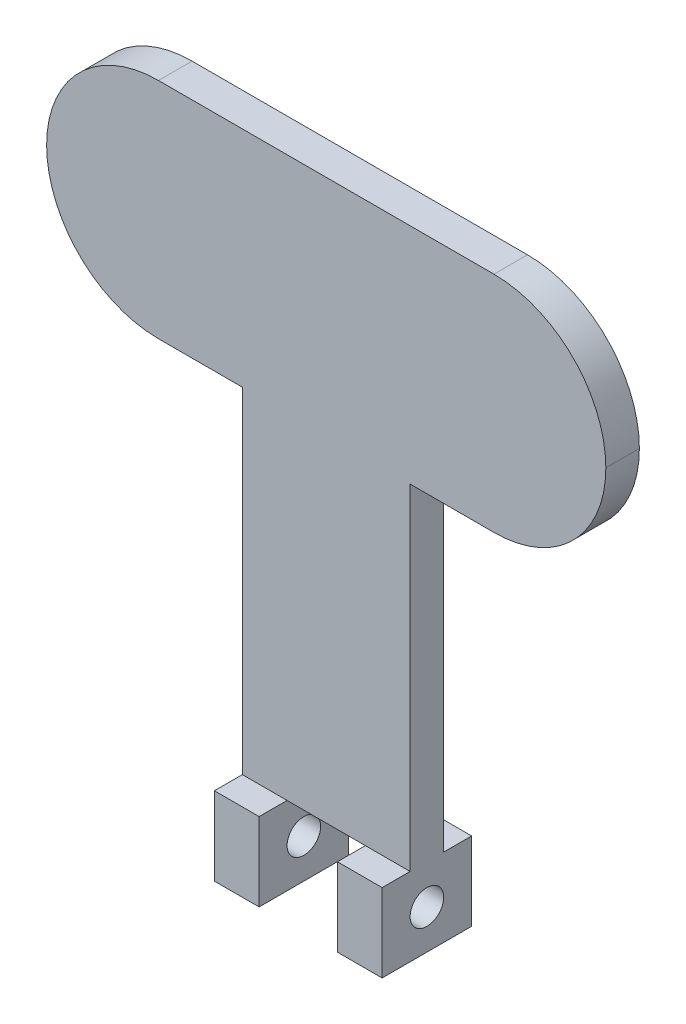
ISO-10303-21;
HEADER;
FILE_DESCRIPTION(('STEP AP214'),'2;1');
FILE_NAME('part.step','',(''),(''),'','','');
FILE_SCHEMA(('AUTOMOTIVE_DESIGN { 1 0 10303 214 1 1 1 1 }'));
ENDSEC;
DATA;
#1=APPLICATION_CONTEXT('core data for automotive mechanical design processes');
#2=APPLICATION_PROTOCOL_DEFINITION('international standard','automotive_design',2000,#1);
#3=PRODUCT_CONTEXT('',#1,'mechanical');
#4=PRODUCT('Part','Part','',(#3));
#5=PRODUCT_RELATED_PRODUCT_CATEGORY('part','',(#4));
#6=PRODUCT_DEFINITION_FORMATION('','',#4);
#7=PRODUCT_DEFINITION_CONTEXT('part definition',#1,'design');
#8=PRODUCT_DEFINITION('design','',#6,#7);
#9=PRODUCT_DEFINITION_SHAPE('','',#8);
#10=(LENGTH_UNIT() NAMED_UNIT(*) SI_UNIT(.MILLI.,.METRE.));
#11=(NAMED_UNIT(*) PLANE_ANGLE_UNIT() SI_UNIT($,.RADIAN.));
#12=(NAMED_UNIT(*) SI_UNIT($,.STERADIAN.) SOLID_ANGLE_UNIT());
#13=UNCERTAINTY_MEASURE_WITH_UNIT(LENGTH_MEASURE(1.E-05),#10,'distance_accuracy_value','');
#14=(GEOMETRIC_REPRESENTATION_CONTEXT(3) GLOBAL_UNCERTAINTY_ASSIGNED_CONTEXT((#13)) GLOBAL_UNIT_ASSIGNED_CONTEXT((#10,
#11,#12)) REPRESENTATION_CONTEXT('',''));
#15=CARTESIAN_POINT('',(0.,0.,0.));
#16=DIRECTION('',(0.,0.,1.));
#17=DIRECTION('',(1.,0.,0.));
#18=AXIS2_PLACEMENT_3D('',#15,#16,#17);
#19=CARTESIAN_POINT('',(7.5,-40.,3.));
#20=DIRECTION('',(0.,-1.,0.));
#21=DIRECTION('',(0.,0.,-1.));
#22=AXIS2_PLACEMENT_3D('',#19,#20,#21);
#23=PLANE('',#22);
#24=DIRECTION('',(-1.,0.,0.));
#25=VECTOR('',#24,1.);
#26=CARTESIAN_POINT('',(7.5,-40.,3.));
#27=LINE('',#26,#25);
#28=CARTESIAN_POINT('',(3.5,-40.,3.));
#29=VERTEX_POINT('',#28);
#30=CARTESIAN_POINT('',(-3.5,-40.,3.));
#31=VERTEX_POINT('',#30);
#32=EDGE_CURVE('E277',#29,#31,#27,.T.);
#33=ORIENTED_EDGE('',*,*,#32,.T.);
#34=DIRECTION('',(0.,0.,-1.));
#35=VECTOR('',#34,1.);
#36=CARTESIAN_POINT('',(-3.5,-40.,3.));
#37=LINE('',#36,#35);
#38=CARTESIAN_POINT('',(-3.5,-40.,0.));
#39=VERTEX_POINT('',#38);
#40=EDGE_CURVE('E11',#31,#39,#37,.T.);
#41=ORIENTED_EDGE('',*,*,#40,.T.);
#42=DIRECTION('',(-1.,0.,0.));
#43=VECTOR('',#42,1.);
#44=CARTESIAN_POINT('',(7.5,-40.,0.));
#45=LINE('',#44,#43);
#46=CARTESIAN_POINT('',(3.5,-40.,0.));
#47=VERTEX_POINT('',#46);
#48=EDGE_CURVE('E287',#47,#39,#45,.T.);
#49=ORIENTED_EDGE('',*,*,#48,.F.);
#50=DIRECTION('',(0.,0.,-1.));
#51=VECTOR('',#50,1.);
#52=CARTESIAN_POINT('',(3.5,-40.,5.5));
#53=LINE('',#52,#51);
#54=EDGE_CURVE('E51',#29,#47,#53,.T.);
#55=ORIENTED_EDGE('',*,*,#54,.F.);
#56=EDGE_LOOP('',(#33,#41,#49,#55));
#57=FACE_BOUND('',#56,.T.);
#58=ADVANCED_FACE('F41',(#57),#23,.T.);
#59=CARTESIAN_POINT('',(-25.,-10.,3.));
#60=DIRECTION('',(0.,1.,0.));
#61=DIRECTION('',(0.,0.,1.));
#62=AXIS2_PLACEMENT_3D('',#59,#60,#61);
#63=PLANE('',#62);
#64=DIRECTION('',(1.,0.,0.));
#65=VECTOR('',#64,1.);
#66=CARTESIAN_POINT('',(-25.,-10.,0.));
#67=LINE('',#66,#65);
#68=CARTESIAN_POINT('',(-15.,-10.,0.));
#69=VERTEX_POINT('',#68);
#70=CARTESIAN_POINT('',(-7.5,-10.,0.));
#71=VERTEX_POINT('',#70);
#72=EDGE_CURVE('E301',#69,#71,#67,.T.);
#73=ORIENTED_EDGE('',*,*,#72,.T.);
#74=DIRECTION('',(0.,0.,-1.));
#75=VECTOR('',#74,1.);
#76=CARTESIAN_POINT('',(-7.5,-10.,3.));
#77=LINE('',#76,#75);
#78=CARTESIAN_POINT('',(-7.5,-10.,3.));
#79=VERTEX_POINT('',#78);
#80=EDGE_CURVE('E276',#79,#71,#77,.T.);
#81=ORIENTED_EDGE('',*,*,#80,.F.);
#82=DIRECTION('',(1.,0.,0.));
#83=VECTOR('',#82,1.);
#84=CARTESIAN_POINT('',(-25.,-10.,3.));
#85=LINE('',#84,#83);
#86=CARTESIAN_POINT('',(-15.,-10.,3.));
#87=VERTEX_POINT('',#86);
#88=EDGE_CURVE('E302',#87,#79,#85,.T.);
#89=ORIENTED_EDGE('',*,*,#88,.F.);
#90=DIRECTION('',(0.,0.,1.));
#91=VECTOR('',#90,1.);
#92=CARTESIAN_POINT('',(-15.,-10.,3.));
#93=LINE('',#92,#91);
#94=EDGE_CURVE('E353',#87,#69,#93,.F.);
#95=ORIENTED_EDGE('',*,*,#94,.T.);
#96=EDGE_LOOP('',(#73,#81,#89,#95));
#97=FACE_BOUND('',#96,.T.);
#98=ADVANCED_FACE('F415',(#97),#63,.F.);
#99=CARTESIAN_POINT('',(-15.,0.,3.));
#100=DIRECTION('',(0.,0.,1.));
#101=DIRECTION('',(1.,0.,0.));
#102=AXIS2_PLACEMENT_3D('',#99,#100,#101);
#103=CYLINDRICAL_SURFACE('',#102,10.);
#104=DIRECTION('',(0.,0.,1.));
#105=VECTOR('',#104,1.);
#106=CARTESIAN_POINT('',(-25.,0.,3.));
#107=LINE('',#106,#105);
#108=CARTESIAN_POINT('',(-25.,0.,3.));
#109=VERTEX_POINT('',#108);
#110=CARTESIAN_POINT('',(-25.,0.,0.));
#111=VERTEX_POINT('',#110);
#112=EDGE_CURVE('E331',#109,#111,#107,.F.);
#113=ORIENTED_EDGE('',*,*,#112,.T.);
#114=CARTESIAN_POINT('',(-15.,0.,0.));
#115=DIRECTION('',(0.,0.,-1.));
#116=DIRECTION('',(-1.,0.,0.));
#117=AXIS2_PLACEMENT_3D('',#114,#115,#116);
#118=CIRCLE('',#117,10.);
#119=EDGE_CURVE('E357',#69,#111,#118,.T.);
#120=ORIENTED_EDGE('',*,*,#119,.F.);
#121=ORIENTED_EDGE('',*,*,#94,.F.);
#122=CARTESIAN_POINT('',(-15.,0.,3.));
#123=DIRECTION('',(0.,0.,-1.));
#124=DIRECTION('',(-1.,0.,0.));
#125=AXIS2_PLACEMENT_3D('',#122,#123,#124);
#126=CIRCLE('',#125,10.);
#127=EDGE_CURVE('E360',#109,#87,#126,.F.);
#128=ORIENTED_EDGE('',*,*,#127,.F.);
#129=EDGE_LOOP('',(#113,#120,#121,#128));
#130=FACE_BOUND('',#129,.T.);
#131=ADVANCED_FACE('F43',(#130),#103,.T.);
#132=CARTESIAN_POINT('',(15.,0.,3.));
#133=DIRECTION('',(0.,0.,-1.));
#134=DIRECTION('',(-1.,0.,0.));
#135=AXIS2_PLACEMENT_3D('',#132,#133,#134);
#136=CYLINDRICAL_SURFACE('',#135,10.);
#137=DIRECTION('',(0.,0.,1.));
#138=VECTOR('',#137,1.);
#139=CARTESIAN_POINT('',(25.,0.,3.));
#140=LINE('',#139,#138);
#141=CARTESIAN_POINT('',(25.,0.,0.));
#142=VERTEX_POINT('',#141);
#143=CARTESIAN_POINT('',(25.,0.,3.));
#144=VERTEX_POINT('',#143);
#145=EDGE_CURVE('E306',#142,#144,#140,.T.);
#146=ORIENTED_EDGE('',*,*,#145,.T.);
#147=CARTESIAN_POINT('',(15.,0.,3.));
#148=DIRECTION('',(0.,0.,-1.));
#149=DIRECTION('',(-1.,0.,0.));
#150=AXIS2_PLACEMENT_3D('',#147,#148,#149);
#151=CIRCLE('',#150,10.);
#152=CARTESIAN_POINT('',(15.,-10.,3.));
#153=VERTEX_POINT('',#152);
#154=EDGE_CURVE('E346',#153,#144,#151,.F.);
#155=ORIENTED_EDGE('',*,*,#154,.F.);
#156=DIRECTION('',(0.,0.,-1.));
#157=VECTOR('',#156,1.);
#158=CARTESIAN_POINT('',(15.,-10.,3.));
#159=LINE('',#158,#157);
#160=CARTESIAN_POINT('',(15.,-10.,0.));
#161=VERTEX_POINT('',#160);
#162=EDGE_CURVE('E342',#161,#153,#159,.F.);
#163=ORIENTED_EDGE('',*,*,#162,.F.);
#164=CARTESIAN_POINT('',(15.,0.,0.));
#165=DIRECTION('',(0.,0.,-1.));
#166=DIRECTION('',(-1.,0.,0.));
#167=AXIS2_PLACEMENT_3D('',#164,#165,#166);
#168=CIRCLE('',#167,10.);
#169=EDGE_CURVE('E349',#142,#161,#168,.T.);
#170=ORIENTED_EDGE('',*,*,#169,.F.);
#171=EDGE_LOOP('',(#146,#155,#163,#170));
#172=FACE_BOUND('',#171,.T.);
#173=ADVANCED_FACE('F616',(#172),#136,.T.);
#174=CARTESIAN_POINT('',(-15.,0.,3.));
#175=DIRECTION('',(0.,0.,1.));
#176=DIRECTION('',(1.,0.,0.));
#177=AXIS2_PLACEMENT_3D('',#174,#175,#176);
#178=CYLINDRICAL_SURFACE('',#177,10.);
#179=DIRECTION('',(0.,0.,1.));
#180=VECTOR('',#179,1.);
#181=CARTESIAN_POINT('',(-15.,10.,3.));
#182=LINE('',#181,#180);
#183=CARTESIAN_POINT('',(-15.,10.,0.));
#184=VERTEX_POINT('',#183);
#185=CARTESIAN_POINT('',(-15.,10.,3.));
#186=VERTEX_POINT('',#185);
#187=EDGE_CURVE('E327',#184,#186,#182,.T.);
#188=ORIENTED_EDGE('',*,*,#187,.F.);
#189=CARTESIAN_POINT('',(-15.,0.,0.));
#190=DIRECTION('',(0.,0.,-1.));
#191=DIRECTION('',(-1.,0.,0.));
#192=AXIS2_PLACEMENT_3D('',#189,#190,#191);
#193=CIRCLE('',#192,10.);
#194=EDGE_CURVE('E335',#111,#184,#193,.T.);
#195=ORIENTED_EDGE('',*,*,#194,.F.);
#196=ORIENTED_EDGE('',*,*,#112,.F.);
#197=CARTESIAN_POINT('',(-15.,0.,3.));
#198=DIRECTION('',(0.,0.,-1.));
#199=DIRECTION('',(-1.,0.,0.));
#200=AXIS2_PLACEMENT_3D('',#197,#198,#199);
#201=CIRCLE('',#200,10.);
#202=EDGE_CURVE('E338',#186,#109,#201,.F.);
#203=ORIENTED_EDGE('',*,*,#202,.F.);
#204=EDGE_LOOP('',(#188,#195,#196,#203));
#205=FACE_BOUND('',#204,.T.);
#206=ADVANCED_FACE('F625',(#205),#178,.T.);
#207=CARTESIAN_POINT('',(15.,0.,3.));
#208=DIRECTION('',(0.,0.,1.));
#209=DIRECTION('',(1.,0.,0.));
#210=AXIS2_PLACEMENT_3D('',#207,#208,#209);
#211=CYLINDRICAL_SURFACE('',#210,10.);
#212=ORIENTED_EDGE('',*,*,#145,.F.);
#213=CARTESIAN_POINT('',(15.,0.,0.));
#214=DIRECTION('',(0.,0.,-1.));
#215=DIRECTION('',(-1.,0.,0.));
#216=AXIS2_PLACEMENT_3D('',#213,#214,#215);
#217=CIRCLE('',#216,10.);
#218=CARTESIAN_POINT('',(15.,10.,0.));
#219=VERTEX_POINT('',#218);
#220=EDGE_CURVE('E320',#219,#142,#217,.T.);
#221=ORIENTED_EDGE('',*,*,#220,.F.);
#222=DIRECTION('',(0.,0.,1.));
#223=VECTOR('',#222,1.);
#224=CARTESIAN_POINT('',(15.,10.,3.));
#225=LINE('',#224,#223);
#226=CARTESIAN_POINT('',(15.,10.,3.));
#227=VERTEX_POINT('',#226);
#228=EDGE_CURVE('E316',#227,#219,#225,.F.);
#229=ORIENTED_EDGE('',*,*,#228,.F.);
#230=CARTESIAN_POINT('',(15.,0.,3.));
#231=DIRECTION('',(0.,0.,-1.));
#232=DIRECTION('',(-1.,0.,0.));
#233=AXIS2_PLACEMENT_3D('',#230,#231,#232);
#234=CIRCLE('',#233,10.);
#235=EDGE_CURVE('E324',#144,#227,#234,.F.);
#236=ORIENTED_EDGE('',*,*,#235,.F.);
#237=EDGE_LOOP('',(#212,#221,#229,#236));
#238=FACE_BOUND('',#237,.T.);
#239=ADVANCED_FACE('F634',(#238),#211,.T.);
#240=CARTESIAN_POINT('',(-25.,10.,3.));
#241=DIRECTION('',(0.,-1.,0.));
#242=DIRECTION('',(0.,0.,-1.));
#243=AXIS2_PLACEMENT_3D('',#240,#241,#242);
#244=PLANE('',#243);
#245=DIRECTION('',(-1.,0.,0.));
#246=VECTOR('',#245,1.);
#247=CARTESIAN_POINT('',(-25.,10.,0.));
#248=LINE('',#247,#246);
#249=EDGE_CURVE('E292',#219,#184,#248,.T.);
#250=ORIENTED_EDGE('',*,*,#249,.T.);
#251=ORIENTED_EDGE('',*,*,#187,.T.);
#252=DIRECTION('',(-1.,0.,0.));
#253=VECTOR('',#252,1.);
#254=CARTESIAN_POINT('',(-25.,10.,3.));
#255=LINE('',#254,#253);
#256=EDGE_CURVE('E296',#227,#186,#255,.T.);
#257=ORIENTED_EDGE('',*,*,#256,.F.);
#258=ORIENTED_EDGE('',*,*,#228,.T.);
#259=EDGE_LOOP('',(#250,#251,#257,#258));
#260=FACE_BOUND('',#259,.T.);
#261=ADVANCED_FACE('F600',(#260),#244,.F.);
#262=CARTESIAN_POINT('',(7.5,-10.,3.));
#263=VERTEX_POINT('',#262);
#264=EDGE_CURVE('E300',#263,#153,#85,.T.);
#265=ORIENTED_EDGE('',*,*,#264,.F.);
#266=DIRECTION('',(0.,0.,-1.));
#267=VECTOR('',#266,1.);
#268=CARTESIAN_POINT('',(7.5,-10.,3.));
#269=LINE('',#268,#267);
#270=CARTESIAN_POINT('',(7.5,-10.,0.));
#271=VERTEX_POINT('',#270);
#272=EDGE_CURVE('E288',#263,#271,#269,.T.);
#273=ORIENTED_EDGE('',*,*,#272,.T.);
#274=EDGE_CURVE('E310',#271,#161,#67,.T.);
#275=ORIENTED_EDGE('',*,*,#274,.T.);
#276=ORIENTED_EDGE('',*,*,#162,.T.);
#277=EDGE_LOOP('',(#265,#273,#275,#276));
#278=FACE_BOUND('',#277,.T.);
#279=ADVANCED_FACE('F480',(#278),#63,.F.);
#280=CARTESIAN_POINT('',(0.,0.,3.));
#281=DIRECTION('',(0.,0.,-1.));
#282=DIRECTION('',(-1.,0.,0.));
#283=AXIS2_PLACEMENT_3D('',#280,#281,#282);
#284=PLANE('',#283);
#285=ORIENTED_EDGE('',*,*,#202,.T.);
#286=ORIENTED_EDGE('',*,*,#127,.T.);
#287=ORIENTED_EDGE('',*,*,#88,.T.);
#288=DIRECTION('',(0.,1.,0.));
#289=VECTOR('',#288,1.);
#290=CARTESIAN_POINT('',(-7.5,-40.,3.));
#291=LINE('',#290,#289);
#292=CARTESIAN_POINT('',(-7.5,-40.,3.));
#293=VERTEX_POINT('',#292);
#294=EDGE_CURVE('E263',#293,#79,#291,.T.);
#295=ORIENTED_EDGE('',*,*,#294,.F.);
#296=EDGE_CURVE('E271',#31,#293,#27,.T.);
#297=ORIENTED_EDGE('',*,*,#296,.F.);
#298=ORIENTED_EDGE('',*,*,#32,.F.);
#299=CARTESIAN_POINT('',(7.5,-40.,3.));
#300=VERTEX_POINT('',#299);
#301=EDGE_CURVE('E272',#300,#29,#27,.T.);
#302=ORIENTED_EDGE('',*,*,#301,.F.);
#303=DIRECTION('',(0.,-1.,0.));
#304=VECTOR('',#303,1.);
#305=CARTESIAN_POINT('',(7.5,-40.,3.));
#306=LINE('',#305,#304);
#307=EDGE_CURVE('E267',#263,#300,#306,.T.);
#308=ORIENTED_EDGE('',*,*,#307,.F.);
#309=ORIENTED_EDGE('',*,*,#264,.T.);
#310=ORIENTED_EDGE('',*,*,#154,.T.);
#311=ORIENTED_EDGE('',*,*,#235,.T.);
#312=ORIENTED_EDGE('',*,*,#256,.T.);
#313=EDGE_LOOP('',(#285,#286,#287,#295,#297,#298,#302,#308,#309,#310,#311,#312));
#314=FACE_BOUND('',#313,.T.);
#315=ADVANCED_FACE('F397',(#314),#284,.F.);
#316=CARTESIAN_POINT('',(0.,0.,0.));
#317=DIRECTION('',(0.,0.,-1.));
#318=DIRECTION('',(-1.,0.,0.));
#319=AXIS2_PLACEMENT_3D('',#316,#317,#318);
#320=PLANE('',#319);
#321=ORIENTED_EDGE('',*,*,#72,.F.);
#322=ORIENTED_EDGE('',*,*,#119,.T.);
#323=ORIENTED_EDGE('',*,*,#194,.T.);
#324=ORIENTED_EDGE('',*,*,#249,.F.);
#325=ORIENTED_EDGE('',*,*,#220,.T.);
#326=ORIENTED_EDGE('',*,*,#169,.T.);
#327=ORIENTED_EDGE('',*,*,#274,.F.);
#328=DIRECTION('',(0.,-1.,0.));
#329=VECTOR('',#328,1.);
#330=CARTESIAN_POINT('',(7.5,-40.,0.));
#331=LINE('',#330,#329);
#332=CARTESIAN_POINT('',(7.5,-40.,0.));
#333=VERTEX_POINT('',#332);
#334=EDGE_CURVE('E281',#271,#333,#331,.T.);
#335=ORIENTED_EDGE('',*,*,#334,.T.);
#336=EDGE_CURVE('E268',#333,#47,#45,.T.);
#337=ORIENTED_EDGE('',*,*,#336,.T.);
#338=ORIENTED_EDGE('',*,*,#48,.T.);
#339=CARTESIAN_POINT('',(-7.5,-40.,0.));
#340=VERTEX_POINT('',#339);
#341=EDGE_CURVE('E284',#39,#340,#45,.T.);
#342=ORIENTED_EDGE('',*,*,#341,.T.);
#343=DIRECTION('',(0.,1.,0.));
#344=VECTOR('',#343,1.);
#345=CARTESIAN_POINT('',(-7.5,-40.,0.));
#346=LINE('',#345,#344);
#347=EDGE_CURVE('E262',#340,#71,#346,.T.);
#348=ORIENTED_EDGE('',*,*,#347,.T.);
#349=EDGE_LOOP('',(#321,#322,#323,#324,#325,#326,#327,#335,#337,#338,#342,#348));
#350=FACE_BOUND('',#349,.T.);
#351=ADVANCED_FACE('F419',(#350),#320,.T.);
#352=CARTESIAN_POINT('',(-7.5,-40.,3.));
#353=DIRECTION('',(-1.,0.,0.));
#354=DIRECTION('',(0.,0.,1.));
#355=AXIS2_PLACEMENT_3D('',#352,#353,#354);
#356=PLANE('',#355);
#357=CARTESIAN_POINT('',(-7.5,-43.5,1.5));
#358=DIRECTION('',(-1.,0.,0.));
#359=DIRECTION('',(0.,0.,1.));
#360=AXIS2_PLACEMENT_3D('',#357,#358,#359);
#361=CIRCLE('',#360,1.5);
#362=CARTESIAN_POINT('',(-7.5,-43.5,3.));
#363=VERTEX_POINT('',#362);
#364=EDGE_CURVE('E446',#363,#363,#361,.T.);
#365=ORIENTED_EDGE('',*,*,#364,.F.);
#366=EDGE_LOOP('',(#365));
#367=FACE_BOUND('',#366,.T.);
#368=ORIENTED_EDGE('',*,*,#347,.F.);
#369=DIRECTION('',(0.,0.,-1.));
#370=VECTOR('',#369,1.);
#371=CARTESIAN_POINT('',(-7.5,-40.,5.5));
#372=LINE('',#371,#370);
#373=CARTESIAN_POINT('',(-7.5,-40.,-2.5));
#374=VERTEX_POINT('',#373);
#375=EDGE_CURVE('E207',#340,#374,#372,.T.);
#376=ORIENTED_EDGE('',*,*,#375,.T.);
#377=DIRECTION('',(0.,1.,0.));
#378=VECTOR('',#377,1.);
#379=CARTESIAN_POINT('',(-7.5,-47.,-2.5));
#380=LINE('',#379,#378);
#381=CARTESIAN_POINT('',(-7.5,-47.,-2.5));
#382=VERTEX_POINT('',#381);
#383=EDGE_CURVE('E187',#382,#374,#380,.T.);
#384=ORIENTED_EDGE('',*,*,#383,.F.);
#385=DIRECTION('',(0.,0.,-1.));
#386=VECTOR('',#385,1.);
#387=CARTESIAN_POINT('',(-7.5,-47.,5.5));
#388=LINE('',#387,#386);
#389=CARTESIAN_POINT('',(-7.5,-47.,5.5));
#390=VERTEX_POINT('',#389);
#391=EDGE_CURVE('E193',#390,#382,#388,.T.);
#392=ORIENTED_EDGE('',*,*,#391,.F.);
#393=DIRECTION('',(0.,1.,0.));
#394=VECTOR('',#393,1.);
#395=CARTESIAN_POINT('',(-7.5,-47.,5.5));
#396=LINE('',#395,#394);
#397=CARTESIAN_POINT('',(-7.5,-40.,5.5));
#398=VERTEX_POINT('',#397);
#399=EDGE_CURVE('E409',#390,#398,#396,.T.);
#400=ORIENTED_EDGE('',*,*,#399,.T.);
#401=EDGE_CURVE('E407',#398,#293,#372,.T.);
#402=ORIENTED_EDGE('',*,*,#401,.T.);
#403=ORIENTED_EDGE('',*,*,#294,.T.);
#404=ORIENTED_EDGE('',*,*,#80,.T.);
#405=EDGE_LOOP('',(#368,#376,#384,#392,#400,#402,#403,#404));
#406=FACE_BOUND('',#405,.T.);
#407=ADVANCED_FACE('F206',(#367,#406),#356,.T.);
#408=CARTESIAN_POINT('',(7.5,-40.,3.));
#409=DIRECTION('',(1.,0.,0.));
#410=DIRECTION('',(0.,0.,-1.));
#411=AXIS2_PLACEMENT_3D('',#408,#409,#410);
#412=PLANE('',#411);
#413=CARTESIAN_POINT('',(7.5,-43.5,1.5));
#414=DIRECTION('',(1.,0.,0.));
#415=DIRECTION('',(0.,0.,-1.));
#416=AXIS2_PLACEMENT_3D('',#413,#414,#415);
#417=CIRCLE('',#416,1.5);
#418=CARTESIAN_POINT('',(7.5,-43.5,0.));
#419=VERTEX_POINT('',#418);
#420=EDGE_CURVE('E456',#419,#419,#417,.T.);
#421=ORIENTED_EDGE('',*,*,#420,.F.);
#422=EDGE_LOOP('',(#421));
#423=FACE_BOUND('',#422,.T.);
#424=ORIENTED_EDGE('',*,*,#334,.F.);
#425=ORIENTED_EDGE('',*,*,#272,.F.);
#426=ORIENTED_EDGE('',*,*,#307,.T.);
#427=DIRECTION('',(0.,0.,1.));
#428=VECTOR('',#427,1.);
#429=CARTESIAN_POINT('',(7.5,-40.,5.5));
#430=LINE('',#429,#428);
#431=CARTESIAN_POINT('',(7.5,-40.,5.5));
#432=VERTEX_POINT('',#431);
#433=EDGE_CURVE('E210',#300,#432,#430,.T.);
#434=ORIENTED_EDGE('',*,*,#433,.T.);
#435=DIRECTION('',(0.,1.,0.));
#436=VECTOR('',#435,1.);
#437=CARTESIAN_POINT('',(7.5,-47.,5.5));
#438=LINE('',#437,#436);
#439=CARTESIAN_POINT('',(7.5,-47.,5.5));
#440=VERTEX_POINT('',#439);
#441=EDGE_CURVE('E258',#440,#432,#438,.T.);
#442=ORIENTED_EDGE('',*,*,#441,.F.);
#443=DIRECTION('',(0.,0.,1.));
#444=VECTOR('',#443,1.);
#445=CARTESIAN_POINT('',(7.5,-47.,5.5));
#446=LINE('',#445,#444);
#447=CARTESIAN_POINT('',(7.5,-47.,-2.5));
#448=VERTEX_POINT('',#447);
#449=EDGE_CURVE('E220',#448,#440,#446,.T.);
#450=ORIENTED_EDGE('',*,*,#449,.F.);
#451=DIRECTION('',(0.,1.,0.));
#452=VECTOR('',#451,1.);
#453=CARTESIAN_POINT('',(7.5,-47.,-2.5));
#454=LINE('',#453,#452);
#455=CARTESIAN_POINT('',(7.5,-40.,-2.5));
#456=VERTEX_POINT('',#455);
#457=EDGE_CURVE('E233',#448,#456,#454,.T.);
#458=ORIENTED_EDGE('',*,*,#457,.T.);
#459=EDGE_CURVE('E214',#456,#333,#430,.T.);
#460=ORIENTED_EDGE('',*,*,#459,.T.);
#461=EDGE_LOOP('',(#424,#425,#426,#434,#442,#450,#458,#460));
#462=FACE_BOUND('',#461,.T.);
#463=ADVANCED_FACE('F382',(#423,#462),#412,.T.);
#464=CARTESIAN_POINT('',(0.,-40.,0.));
#465=DIRECTION('',(0.,-1.,0.));
#466=DIRECTION('',(0.,0.,-1.));
#467=AXIS2_PLACEMENT_3D('',#464,#465,#466);
#468=PLANE('',#467);
#469=ORIENTED_EDGE('',*,*,#433,.F.);
#470=ORIENTED_EDGE('',*,*,#301,.T.);
#471=CARTESIAN_POINT('',(3.5,-40.,5.5));
#472=VERTEX_POINT('',#471);
#473=EDGE_CURVE('E241',#472,#29,#53,.T.);
#474=ORIENTED_EDGE('',*,*,#473,.F.);
#475=DIRECTION('',(-1.,0.,0.));
#476=VECTOR('',#475,1.);
#477=CARTESIAN_POINT('',(3.5,-40.,5.5));
#478=LINE('',#477,#476);
#479=EDGE_CURVE('E237',#432,#472,#478,.T.);
#480=ORIENTED_EDGE('',*,*,#479,.F.);
#481=EDGE_LOOP('',(#469,#470,#474,#480));
#482=FACE_BOUND('',#481,.T.);
#483=ADVANCED_FACE('F394',(#482),#468,.F.);
#484=CARTESIAN_POINT('',(3.5,-47.,5.5));
#485=DIRECTION('',(0.,0.,-1.));
#486=DIRECTION('',(-1.,0.,0.));
#487=AXIS2_PLACEMENT_3D('',#484,#485,#486);
#488=PLANE('',#487);
#489=ORIENTED_EDGE('',*,*,#479,.T.);
#490=DIRECTION('',(0.,1.,0.));
#491=VECTOR('',#490,1.);
#492=CARTESIAN_POINT('',(3.5,-47.,5.5));
#493=LINE('',#492,#491);
#494=CARTESIAN_POINT('',(3.5,-47.,5.5));
#495=VERTEX_POINT('',#494);
#496=EDGE_CURVE('E254',#495,#472,#493,.T.);
#497=ORIENTED_EDGE('',*,*,#496,.F.);
#498=DIRECTION('',(-1.,0.,0.));
#499=VECTOR('',#498,1.);
#500=CARTESIAN_POINT('',(3.5,-47.,5.5));
#501=LINE('',#500,#499);
#502=EDGE_CURVE('E224',#440,#495,#501,.T.);
#503=ORIENTED_EDGE('',*,*,#502,.F.);
#504=ORIENTED_EDGE('',*,*,#441,.T.);
#505=EDGE_LOOP('',(#489,#497,#503,#504));
#506=FACE_BOUND('',#505,.T.);
#507=ADVANCED_FACE('F470',(#506),#488,.F.);
#508=CARTESIAN_POINT('',(3.5,-47.,5.5));
#509=DIRECTION('',(1.,0.,0.));
#510=DIRECTION('',(0.,0.,-1.));
#511=AXIS2_PLACEMENT_3D('',#508,#509,#510);
#512=PLANE('',#511);
#513=CARTESIAN_POINT('',(3.5,-43.5,1.5));
#514=DIRECTION('',(1.,0.,0.));
#515=DIRECTION('',(0.,0.,-1.));
#516=AXIS2_PLACEMENT_3D('',#513,#514,#515);
#517=CIRCLE('',#516,1.5);
#518=CARTESIAN_POINT('',(3.5,-43.5,0.));
#519=VERTEX_POINT('',#518);
#520=EDGE_CURVE('E449',#519,#519,#517,.T.);
#521=ORIENTED_EDGE('',*,*,#520,.T.);
#522=EDGE_LOOP('',(#521));
#523=FACE_BOUND('',#522,.T.);
#524=ORIENTED_EDGE('',*,*,#473,.T.);
#525=ORIENTED_EDGE('',*,*,#54,.T.);
#526=CARTESIAN_POINT('',(3.5,-40.,-2.5));
#527=VERTEX_POINT('',#526);
#528=EDGE_CURVE('E240',#47,#527,#53,.T.);
#529=ORIENTED_EDGE('',*,*,#528,.T.);
#530=DIRECTION('',(0.,1.,0.));
#531=VECTOR('',#530,1.);
#532=CARTESIAN_POINT('',(3.5,-47.,-2.5));
#533=LINE('',#532,#531);
#534=CARTESIAN_POINT('',(3.5,-47.,-2.5));
#535=VERTEX_POINT('',#534);
#536=EDGE_CURVE('E250',#535,#527,#533,.T.);
#537=ORIENTED_EDGE('',*,*,#536,.F.);
#538=DIRECTION('',(0.,0.,-1.));
#539=VECTOR('',#538,1.);
#540=CARTESIAN_POINT('',(3.5,-47.,5.5));
#541=LINE('',#540,#539);
#542=EDGE_CURVE('E228',#495,#535,#541,.T.);
#543=ORIENTED_EDGE('',*,*,#542,.F.);
#544=ORIENTED_EDGE('',*,*,#496,.T.);
#545=EDGE_LOOP('',(#524,#525,#529,#537,#543,#544));
#546=FACE_BOUND('',#545,.T.);
#547=ADVANCED_FACE('F369',(#523,#546),#512,.F.);
#548=CARTESIAN_POINT('',(3.5,-47.,-2.5));
#549=DIRECTION('',(0.,0.,1.));
#550=DIRECTION('',(1.,0.,0.));
#551=AXIS2_PLACEMENT_3D('',#548,#549,#550);
#552=PLANE('',#551);
#553=DIRECTION('',(1.,0.,0.));
#554=VECTOR('',#553,1.);
#555=CARTESIAN_POINT('',(3.5,-40.,-2.5));
#556=LINE('',#555,#554);
#557=EDGE_CURVE('E225',#527,#456,#556,.T.);
#558=ORIENTED_EDGE('',*,*,#557,.T.);
#559=ORIENTED_EDGE('',*,*,#457,.F.);
#560=DIRECTION('',(1.,0.,0.));
#561=VECTOR('',#560,1.);
#562=CARTESIAN_POINT('',(3.5,-47.,-2.5));
#563=LINE('',#562,#561);
#564=EDGE_CURVE('E231',#535,#448,#563,.T.);
#565=ORIENTED_EDGE('',*,*,#564,.F.);
#566=ORIENTED_EDGE('',*,*,#536,.T.);
#567=EDGE_LOOP('',(#558,#559,#565,#566));
#568=FACE_BOUND('',#567,.T.);
#569=ADVANCED_FACE('F376',(#568),#552,.F.);
#570=CARTESIAN_POINT('',(0.,-47.,0.));
#571=DIRECTION('',(0.,-1.,0.));
#572=DIRECTION('',(0.,0.,-1.));
#573=AXIS2_PLACEMENT_3D('',#570,#571,#572);
#574=PLANE('',#573);
#575=ORIENTED_EDGE('',*,*,#449,.T.);
#576=ORIENTED_EDGE('',*,*,#502,.T.);
#577=ORIENTED_EDGE('',*,*,#542,.T.);
#578=ORIENTED_EDGE('',*,*,#564,.T.);
#579=EDGE_LOOP('',(#575,#576,#577,#578));
#580=FACE_BOUND('',#579,.T.);
#581=ADVANCED_FACE('F387',(#580),#574,.T.);
#582=ORIENTED_EDGE('',*,*,#336,.F.);
#583=ORIENTED_EDGE('',*,*,#459,.F.);
#584=ORIENTED_EDGE('',*,*,#557,.F.);
#585=ORIENTED_EDGE('',*,*,#528,.F.);
#586=EDGE_LOOP('',(#582,#583,#584,#585));
#587=FACE_BOUND('',#586,.T.);
#588=ADVANCED_FACE('F379',(#587),#468,.F.);
#589=CARTESIAN_POINT('',(0.,-40.,0.));
#590=DIRECTION('',(0.,1.,0.));
#591=DIRECTION('',(0.,0.,1.));
#592=AXIS2_PLACEMENT_3D('',#589,#590,#591);
#593=PLANE('',#592);
#594=ORIENTED_EDGE('',*,*,#296,.T.);
#595=ORIENTED_EDGE('',*,*,#401,.F.);
#596=DIRECTION('',(-1.,0.,0.));
#597=VECTOR('',#596,1.);
#598=CARTESIAN_POINT('',(-3.5,-40.,5.5));
#599=LINE('',#598,#597);
#600=CARTESIAN_POINT('',(-3.5,-40.,5.5));
#601=VERTEX_POINT('',#600);
#602=EDGE_CURVE('E203',#601,#398,#599,.T.);
#603=ORIENTED_EDGE('',*,*,#602,.F.);
#604=DIRECTION('',(0.,0.,1.));
#605=VECTOR('',#604,1.);
#606=CARTESIAN_POINT('',(-3.5,-40.,5.5));
#607=LINE('',#606,#605);
#608=EDGE_CURVE('E408',#31,#601,#607,.T.);
#609=ORIENTED_EDGE('',*,*,#608,.F.);
#610=EDGE_LOOP('',(#594,#595,#603,#609));
#611=FACE_BOUND('',#610,.T.);
#612=ADVANCED_FACE('F405',(#611),#593,.T.);
#613=CARTESIAN_POINT('',(-3.5,-47.,-2.5));
#614=DIRECTION('',(0.,0.,1.));
#615=DIRECTION('',(1.,0.,0.));
#616=AXIS2_PLACEMENT_3D('',#613,#614,#615);
#617=PLANE('',#616);
#618=DIRECTION('',(1.,0.,0.));
#619=VECTOR('',#618,1.);
#620=CARTESIAN_POINT('',(-3.5,-40.,-2.5));
#621=LINE('',#620,#619);
#622=CARTESIAN_POINT('',(-3.5,-40.,-2.5));
#623=VERTEX_POINT('',#622);
#624=EDGE_CURVE('E411',#374,#623,#621,.T.);
#625=ORIENTED_EDGE('',*,*,#624,.T.);
#626=DIRECTION('',(0.,1.,0.));
#627=VECTOR('',#626,1.);
#628=CARTESIAN_POINT('',(-3.5,-47.,-2.5));
#629=LINE('',#628,#627);
#630=CARTESIAN_POINT('',(-3.5,-47.,-2.5));
#631=VERTEX_POINT('',#630);
#632=EDGE_CURVE('E188',#631,#623,#629,.T.);
#633=ORIENTED_EDGE('',*,*,#632,.F.);
#634=DIRECTION('',(1.,0.,0.));
#635=VECTOR('',#634,1.);
#636=CARTESIAN_POINT('',(-3.5,-47.,-2.5));
#637=LINE('',#636,#635);
#638=EDGE_CURVE('E183',#382,#631,#637,.T.);
#639=ORIENTED_EDGE('',*,*,#638,.F.);
#640=ORIENTED_EDGE('',*,*,#383,.T.);
#641=EDGE_LOOP('',(#625,#633,#639,#640));
#642=FACE_BOUND('',#641,.T.);
#643=ADVANCED_FACE('F185',(#642),#617,.F.);
#644=CARTESIAN_POINT('',(-3.5,-47.,5.5));
#645=DIRECTION('',(-1.,0.,0.));
#646=DIRECTION('',(0.,0.,1.));
#647=AXIS2_PLACEMENT_3D('',#644,#645,#646);
#648=PLANE('',#647);
#649=CARTESIAN_POINT('',(-3.5,-43.5,1.5));
#650=DIRECTION('',(-1.,0.,0.));
#651=DIRECTION('',(0.,0.,1.));
#652=AXIS2_PLACEMENT_3D('',#649,#650,#651);
#653=CIRCLE('',#652,1.5);
#654=CARTESIAN_POINT('',(-3.5,-43.5,3.));
#655=VERTEX_POINT('',#654);
#656=EDGE_CURVE('E45',#655,#655,#653,.T.);
#657=ORIENTED_EDGE('',*,*,#656,.T.);
#658=EDGE_LOOP('',(#657));
#659=FACE_BOUND('',#658,.T.);
#660=EDGE_CURVE('E58',#623,#39,#607,.T.);
#661=ORIENTED_EDGE('',*,*,#660,.T.);
#662=ORIENTED_EDGE('',*,*,#40,.F.);
#663=ORIENTED_EDGE('',*,*,#608,.T.);
#664=DIRECTION('',(0.,1.,0.));
#665=VECTOR('',#664,1.);
#666=CARTESIAN_POINT('',(-3.5,-47.,5.5));
#667=LINE('',#666,#665);
#668=CARTESIAN_POINT('',(-3.5,-47.,5.5));
#669=VERTEX_POINT('',#668);
#670=EDGE_CURVE('E216',#669,#601,#667,.T.);
#671=ORIENTED_EDGE('',*,*,#670,.F.);
#672=DIRECTION('',(0.,0.,1.));
#673=VECTOR('',#672,1.);
#674=CARTESIAN_POINT('',(-3.5,-47.,5.5));
#675=LINE('',#674,#673);
#676=EDGE_CURVE('E192',#631,#669,#675,.T.);
#677=ORIENTED_EDGE('',*,*,#676,.F.);
#678=ORIENTED_EDGE('',*,*,#632,.T.);
#679=EDGE_LOOP('',(#661,#662,#663,#671,#677,#678));
#680=FACE_BOUND('',#679,.T.);
#681=ADVANCED_FACE('F425',(#659,#680),#648,.F.);
#682=CARTESIAN_POINT('',(-3.5,-47.,5.5));
#683=DIRECTION('',(0.,0.,-1.));
#684=DIRECTION('',(-1.,0.,0.));
#685=AXIS2_PLACEMENT_3D('',#682,#683,#684);
#686=PLANE('',#685);
#687=ORIENTED_EDGE('',*,*,#602,.T.);
#688=ORIENTED_EDGE('',*,*,#399,.F.);
#689=DIRECTION('',(-1.,0.,0.));
#690=VECTOR('',#689,1.);
#691=CARTESIAN_POINT('',(-3.5,-47.,5.5));
#692=LINE('',#691,#690);
#693=EDGE_CURVE('E198',#669,#390,#692,.T.);
#694=ORIENTED_EDGE('',*,*,#693,.F.);
#695=ORIENTED_EDGE('',*,*,#670,.T.);
#696=EDGE_LOOP('',(#687,#688,#694,#695));
#697=FACE_BOUND('',#696,.T.);
#698=ADVANCED_FACE('F431',(#697),#686,.F.);
#699=CARTESIAN_POINT('',(0.,-47.,0.));
#700=DIRECTION('',(0.,1.,0.));
#701=DIRECTION('',(0.,0.,1.));
#702=AXIS2_PLACEMENT_3D('',#699,#700,#701);
#703=PLANE('',#702);
#704=ORIENTED_EDGE('',*,*,#391,.T.);
#705=ORIENTED_EDGE('',*,*,#638,.T.);
#706=ORIENTED_EDGE('',*,*,#676,.T.);
#707=ORIENTED_EDGE('',*,*,#693,.T.);
#708=EDGE_LOOP('',(#704,#705,#706,#707));
#709=FACE_BOUND('',#708,.T.);
#710=ADVANCED_FACE('F196',(#709),#703,.F.);
#711=ORIENTED_EDGE('',*,*,#375,.F.);
#712=ORIENTED_EDGE('',*,*,#341,.F.);
#713=ORIENTED_EDGE('',*,*,#660,.F.);
#714=ORIENTED_EDGE('',*,*,#624,.F.);
#715=EDGE_LOOP('',(#711,#712,#713,#714));
#716=FACE_BOUND('',#715,.T.);
#717=ADVANCED_FACE('F424',(#716),#593,.T.);
#718=CARTESIAN_POINT('',(-25.,-43.5,1.5));
#719=DIRECTION('',(1.,0.,0.));
#720=DIRECTION('',(0.,0.,-1.));
#721=AXIS2_PLACEMENT_3D('',#718,#719,#720);
#722=CYLINDRICAL_SURFACE('',#721,1.5);
#723=ORIENTED_EDGE('',*,*,#364,.T.);
#724=EDGE_LOOP('',(#723));
#725=FACE_BOUND('',#724,.T.);
#726=ORIENTED_EDGE('',*,*,#656,.F.);
#727=EDGE_LOOP('',(#726));
#728=FACE_BOUND('',#727,.T.);
#729=ADVANCED_FACE('F501',(#725,#728),#722,.F.);
#730=ORIENTED_EDGE('',*,*,#420,.T.);
#731=EDGE_LOOP('',(#730));
#732=FACE_BOUND('',#731,.T.);
#733=ORIENTED_EDGE('',*,*,#520,.F.);
#734=EDGE_LOOP('',(#733));
#735=FACE_BOUND('',#734,.T.);
#736=ADVANCED_FACE('F461',(#732,#735),#722,.F.);
#737=CLOSED_SHELL('',(#58,#98,#131,#173,#206,#239,#261,#279,#315,#351,#407,#463,#483,#507,#547,
#569,#581,#588,#612,#643,#681,#698,#710,#717,#729,#736));
#738=MANIFOLD_SOLID_BREP('B2',#737);
#739=ADVANCED_BREP_SHAPE_REPRESENTATION('',(#18,#738),#14);
#740=SHAPE_DEFINITION_REPRESENTATION(#9,#739);
ENDSEC;
END-ISO-10303-21;
